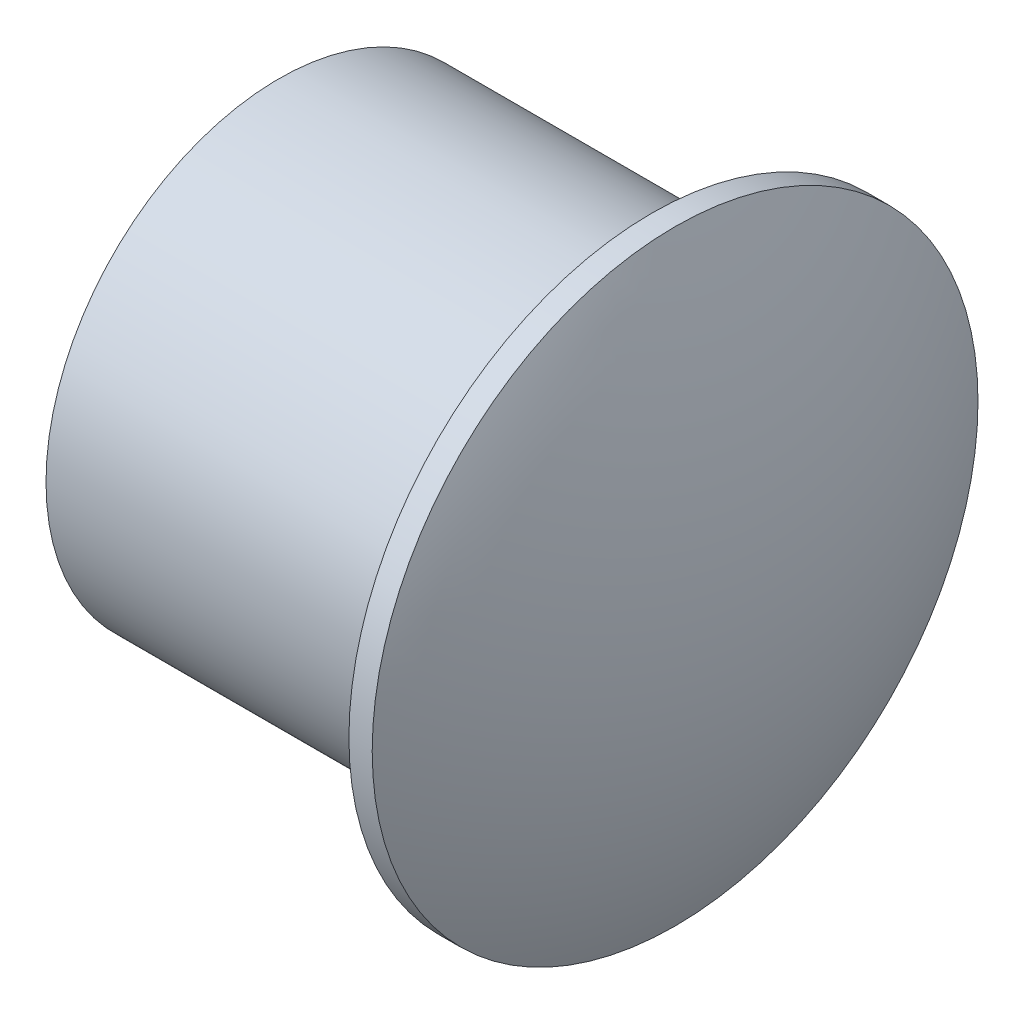
ISO-10303-21;
HEADER;
FILE_DESCRIPTION(('STEP AP214'),'2;1');
FILE_NAME('part.step','',(''),(''),'','','');
FILE_SCHEMA(('AUTOMOTIVE_DESIGN { 1 0 10303 214 1 1 1 1 }'));
ENDSEC;
DATA;
#1=APPLICATION_CONTEXT('core data for automotive mechanical design processes');
#2=APPLICATION_PROTOCOL_DEFINITION('international standard','automotive_design',2000,#1);
#3=PRODUCT_CONTEXT('',#1,'mechanical');
#4=PRODUCT('Part','Part','',(#3));
#5=PRODUCT_RELATED_PRODUCT_CATEGORY('part','',(#4));
#6=PRODUCT_DEFINITION_FORMATION('','',#4);
#7=PRODUCT_DEFINITION_CONTEXT('part definition',#1,'design');
#8=PRODUCT_DEFINITION('design','',#6,#7);
#9=PRODUCT_DEFINITION_SHAPE('','',#8);
#10=(LENGTH_UNIT() NAMED_UNIT(*) SI_UNIT(.MILLI.,.METRE.));
#11=(NAMED_UNIT(*) PLANE_ANGLE_UNIT() SI_UNIT($,.RADIAN.));
#12=(NAMED_UNIT(*) SI_UNIT($,.STERADIAN.) SOLID_ANGLE_UNIT());
#13=UNCERTAINTY_MEASURE_WITH_UNIT(LENGTH_MEASURE(1.E-05),#10,'distance_accuracy_value','');
#14=(GEOMETRIC_REPRESENTATION_CONTEXT(3) GLOBAL_UNCERTAINTY_ASSIGNED_CONTEXT((#13)) GLOBAL_UNIT_ASSIGNED_CONTEXT((#10,
#11,#12)) REPRESENTATION_CONTEXT('',''));
#15=CARTESIAN_POINT('',(0.,0.,0.));
#16=DIRECTION('',(0.,0.,1.));
#17=DIRECTION('',(1.,0.,0.));
#18=AXIS2_PLACEMENT_3D('',#15,#16,#17);
#19=CARTESIAN_POINT('',(0.,0.,0.));
#20=DIRECTION('',(1.,0.,0.));
#21=DIRECTION('',(0.,0.,-1.));
#22=AXIS2_PLACEMENT_3D('',#19,#20,#21);
#23=PLANE('',#22);
#24=CARTESIAN_POINT('',(0.,0.,0.));
#25=DIRECTION('',(-1.,0.,0.));
#26=DIRECTION('',(0.,0.,1.));
#27=AXIS2_PLACEMENT_3D('',#24,#25,#26);
#28=CIRCLE('',#27,10.);
#29=CARTESIAN_POINT('',(0.,0.,10.));
#30=VERTEX_POINT('',#29);
#31=EDGE_CURVE('E10',#30,#30,#28,.T.);
#32=ORIENTED_EDGE('',*,*,#31,.T.);
#33=EDGE_LOOP('',(#32));
#34=FACE_BOUND('',#33,.T.);
#35=ADVANCED_FACE('F37',(#34),#23,.F.);
#36=CARTESIAN_POINT('',(0.,0.,0.));
#37=DIRECTION('',(-1.,0.,0.));
#38=DIRECTION('',(0.,0.,1.));
#39=AXIS2_PLACEMENT_3D('',#36,#37,#38);
#40=CYLINDRICAL_SURFACE('',#39,10.);
#41=ORIENTED_EDGE('',*,*,#31,.F.);
#42=EDGE_LOOP('',(#41));
#43=FACE_BOUND('',#42,.T.);
#44=CARTESIAN_POINT('',(16.,0.,0.));
#45=DIRECTION('',(-1.,0.,0.));
#46=DIRECTION('',(0.,0.,1.));
#47=AXIS2_PLACEMENT_3D('',#44,#45,#46);
#48=CIRCLE('',#47,10.);
#49=CARTESIAN_POINT('',(16.,0.,10.));
#50=VERTEX_POINT('',#49);
#51=EDGE_CURVE('E43',#50,#50,#48,.T.);
#52=ORIENTED_EDGE('',*,*,#51,.T.);
#53=EDGE_LOOP('',(#52));
#54=FACE_BOUND('',#53,.T.);
#55=ADVANCED_FACE('F69',(#43,#54),#40,.T.);
#56=CARTESIAN_POINT('',(16.,10.,0.));
#57=DIRECTION('',(1.,0.,0.));
#58=DIRECTION('',(0.,0.,-1.));
#59=AXIS2_PLACEMENT_3D('',#56,#57,#58);
#60=PLANE('',#59);
#61=ORIENTED_EDGE('',*,*,#51,.F.);
#62=EDGE_LOOP('',(#61));
#63=FACE_BOUND('',#62,.T.);
#64=CARTESIAN_POINT('',(16.,0.,0.));
#65=DIRECTION('',(-1.,0.,0.));
#66=DIRECTION('',(0.,0.,1.));
#67=AXIS2_PLACEMENT_3D('',#64,#65,#66);
#68=CIRCLE('',#67,13.);
#69=CARTESIAN_POINT('',(16.,0.,13.));
#70=VERTEX_POINT('',#69);
#71=EDGE_CURVE('E47',#70,#70,#68,.T.);
#72=ORIENTED_EDGE('',*,*,#71,.T.);
#73=EDGE_LOOP('',(#72));
#74=FACE_BOUND('',#73,.T.);
#75=ADVANCED_FACE('F65',(#63,#74),#60,.F.);
#76=CARTESIAN_POINT('',(0.,0.,0.));
#77=DIRECTION('',(-1.,0.,0.));
#78=DIRECTION('',(0.,0.,1.));
#79=AXIS2_PLACEMENT_3D('',#76,#77,#78);
#80=CYLINDRICAL_SURFACE('',#79,13.);
#81=ORIENTED_EDGE('',*,*,#71,.F.);
#82=EDGE_LOOP('',(#81));
#83=FACE_BOUND('',#82,.T.);
#84=CARTESIAN_POINT('',(17.,0.,0.));
#85=DIRECTION('',(-1.,0.,0.));
#86=DIRECTION('',(0.,0.,1.));
#87=AXIS2_PLACEMENT_3D('',#84,#85,#86);
#88=CIRCLE('',#87,13.);
#89=CARTESIAN_POINT('',(17.,0.,13.));
#90=VERTEX_POINT('',#89);
#91=EDGE_CURVE('E51',#90,#90,#88,.T.);
#92=ORIENTED_EDGE('',*,*,#91,.T.);
#93=EDGE_LOOP('',(#92));
#94=FACE_BOUND('',#93,.T.);
#95=ADVANCED_FACE('F57',(#83,#94),#80,.T.);
#96=CARTESIAN_POINT('',(-9.66666666666668,0.,0.));
#97=DIRECTION('',(-1.,0.,0.));
#98=DIRECTION('',(0.,1.,0.));
#99=AXIS2_PLACEMENT_3D('',#96,#97,#98);
#100=SPHERICAL_SURFACE('',#99,29.6666666666667);
#101=ORIENTED_EDGE('',*,*,#91,.F.);
#102=EDGE_LOOP('',(#101));
#103=FACE_BOUND('',#102,.T.);
#104=ADVANCED_FACE('F59',(#103),#100,.T.);
#105=CLOSED_SHELL('',(#35,#55,#75,#95,#104));
#106=MANIFOLD_SOLID_BREP('B2',#105);
#107=ADVANCED_BREP_SHAPE_REPRESENTATION('',(#18,#106),#14);
#108=SHAPE_DEFINITION_REPRESENTATION(#9,#107);
ENDSEC;
END-ISO-10303-21;
